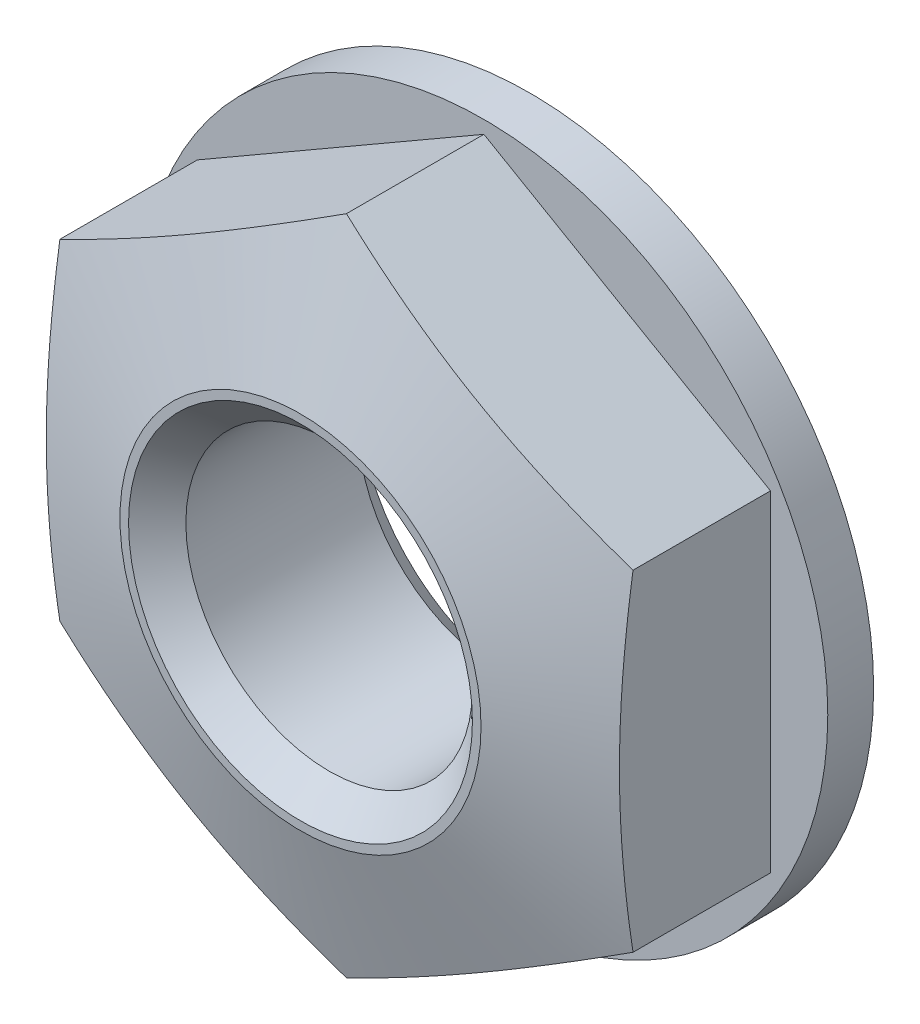
ISO-10303-21;
HEADER;
FILE_DESCRIPTION(('STEP AP214'),'2;1');
FILE_NAME('part.step','',(''),(''),'','','');
FILE_SCHEMA(('AUTOMOTIVE_DESIGN { 1 0 10303 214 1 1 1 1 }'));
ENDSEC;
DATA;
#1=APPLICATION_CONTEXT('core data for automotive mechanical design processes');
#2=APPLICATION_PROTOCOL_DEFINITION('international standard','automotive_design',2000,#1);
#3=PRODUCT_CONTEXT('',#1,'mechanical');
#4=PRODUCT('Part','Part','',(#3));
#5=PRODUCT_RELATED_PRODUCT_CATEGORY('part','',(#4));
#6=PRODUCT_DEFINITION_FORMATION('','',#4);
#7=PRODUCT_DEFINITION_CONTEXT('part definition',#1,'design');
#8=PRODUCT_DEFINITION('design','',#6,#7);
#9=PRODUCT_DEFINITION_SHAPE('','',#8);
#10=(LENGTH_UNIT() NAMED_UNIT(*) SI_UNIT(.MILLI.,.METRE.));
#11=(NAMED_UNIT(*) PLANE_ANGLE_UNIT() SI_UNIT($,.RADIAN.));
#12=(NAMED_UNIT(*) SI_UNIT($,.STERADIAN.) SOLID_ANGLE_UNIT());
#13=UNCERTAINTY_MEASURE_WITH_UNIT(LENGTH_MEASURE(1.E-05),#10,'distance_accuracy_value','');
#14=(GEOMETRIC_REPRESENTATION_CONTEXT(3) GLOBAL_UNCERTAINTY_ASSIGNED_CONTEXT((#13)) GLOBAL_UNIT_ASSIGNED_CONTEXT((#10,
#11,#12)) REPRESENTATION_CONTEXT('',''));
#15=CARTESIAN_POINT('',(0.,0.,0.));
#16=DIRECTION('',(0.,0.,1.));
#17=DIRECTION('',(1.,0.,0.));
#18=AXIS2_PLACEMENT_3D('',#15,#16,#17);
#19=CARTESIAN_POINT('',(5.,2.88675134594813,4.));
#20=DIRECTION('',(-0.5,-0.866025403784439,0.));
#21=DIRECTION('',(0.866025403784439,-0.5,0.));
#22=AXIS2_PLACEMENT_3D('',#19,#20,#21);
#23=PLANE('',#22);
#24=CARTESIAN_POINT('',(5.0002,2.88663587589429,3.19787943040062));
#25=CARTESIAN_POINT('',(4.79275315005902,3.00640537055026,3.23451207718111));
#26=CARTESIAN_POINT('',(4.58481913141722,3.12645613218678,3.26779270758337));
#27=CARTESIAN_POINT('',(4.16799578240542,3.36710920494327,3.3262927245739));
#28=CARTESIAN_POINT('',(3.95910599971381,3.48771177721123,3.35150778062892));
#29=CARTESIAN_POINT('',(3.54201529126278,3.72851921001192,3.39233992073676));
#30=CARTESIAN_POINT('',(3.33381913247233,3.84872131833384,3.4080202023214));
#31=CARTESIAN_POINT('',(2.91708191432316,4.08932466341359,3.4290480365763));
#32=CARTESIAN_POINT('',(2.70854095716158,4.2097258411679,3.43439823930148));
#33=CARTESIAN_POINT('',(2.29145904283842,4.45052819667649,3.43439823930148));
#34=CARTESIAN_POINT('',(2.08291808567684,4.57092937443079,3.4290480365763));
#35=CARTESIAN_POINT('',(1.66618086752767,4.81153271951055,3.4080202023214));
#36=CARTESIAN_POINT('',(1.45798470873722,4.93173482783247,3.39233992073676));
#37=CARTESIAN_POINT('',(1.04089400028619,5.17254226063316,3.35150778062892));
#38=CARTESIAN_POINT('',(0.832004217594584,5.29314483290112,3.3262927245739));
#39=CARTESIAN_POINT('',(0.415180868582782,5.53379790565761,3.26779270758337));
#40=CARTESIAN_POINT('',(0.207246849940983,5.65384866729413,3.23451207718112));
#41=CARTESIAN_POINT('',(-0.000199999999998796,5.7736181619501,3.19787943040062));
#42=B_SPLINE_CURVE_WITH_KNOTS('',3,(#24,#25,#26,#27,#28,#29,#30,#31,#32,#33,#34,#35,#36,#37,#38,
#39,#40,#41),.UNSPECIFIED.,.F.,.F.,(4,2,2,2,2,2,2,2,4),(0.,0.727022535617263,1.45443476834913,
2.17697153055248,2.89932291017882,3.62167428980516,4.34421105200851,5.07162328474038,
5.79864582035764),.UNSPECIFIED.);
#43=CARTESIAN_POINT('',(5.,2.88675134594813,3.19791473419793));
#44=VERTEX_POINT('',#43);
#45=CARTESIAN_POINT('',(0.,5.77350269189626,3.19791473419793));
#46=VERTEX_POINT('',#45);
#47=EDGE_CURVE('E100',#44,#46,#42,.T.);
#48=ORIENTED_EDGE('',*,*,#47,.F.);
#49=DIRECTION('',(0.,0.,-1.));
#50=VECTOR('',#49,1.);
#51=CARTESIAN_POINT('',(5.,2.88675134594813,4.));
#52=LINE('',#51,#50);
#53=CARTESIAN_POINT('',(5.,2.88675134594813,0.8));
#54=VERTEX_POINT('',#53);
#55=EDGE_CURVE('E69',#44,#54,#52,.T.);
#56=ORIENTED_EDGE('',*,*,#55,.T.);
#57=DIRECTION('',(-0.866025403784439,0.5,0.));
#58=VECTOR('',#57,1.);
#59=CARTESIAN_POINT('',(5.,2.88675134594813,0.8));
#60=LINE('',#59,#58);
#61=CARTESIAN_POINT('',(0.,5.77350269189626,0.8));
#62=VERTEX_POINT('',#61);
#63=EDGE_CURVE('E110',#54,#62,#60,.T.);
#64=ORIENTED_EDGE('',*,*,#63,.T.);
#65=DIRECTION('',(0.,0.,-1.));
#66=VECTOR('',#65,1.);
#67=CARTESIAN_POINT('',(0.,5.77350269189626,4.));
#68=LINE('',#67,#66);
#69=EDGE_CURVE('E108',#46,#62,#68,.T.);
#70=ORIENTED_EDGE('',*,*,#69,.F.);
#71=EDGE_LOOP('',(#48,#56,#64,#70));
#72=FACE_BOUND('',#71,.T.);
#73=ADVANCED_FACE('F44',(#72),#23,.F.);
#74=CARTESIAN_POINT('',(0.,5.77350269189626,4.));
#75=DIRECTION('',(0.5,-0.866025403784439,0.));
#76=DIRECTION('',(0.866025403784439,0.5,0.));
#77=AXIS2_PLACEMENT_3D('',#74,#75,#76);
#78=PLANE('',#77);
#79=CARTESIAN_POINT('',(0.000200000000001004,5.7736181619501,3.19787943040062));
#80=CARTESIAN_POINT('',(-0.207246849940981,5.65384866729413,3.23451207718112));
#81=CARTESIAN_POINT('',(-0.41518086858278,5.53379790565761,3.26779270758337));
#82=CARTESIAN_POINT('',(-0.832004217594582,5.29314483290112,3.3262927245739));
#83=CARTESIAN_POINT('',(-1.04089400028619,5.17254226063316,3.35150778062892));
#84=CARTESIAN_POINT('',(-1.45798470873721,4.93173482783247,3.39233992073676));
#85=CARTESIAN_POINT('',(-1.66618086752767,4.81153271951055,3.4080202023214));
#86=CARTESIAN_POINT('',(-2.08291808567684,4.5709293744308,3.4290480365763));
#87=CARTESIAN_POINT('',(-2.29145904283842,4.45052819667649,3.43439823930148));
#88=CARTESIAN_POINT('',(-2.70854095716158,4.2097258411679,3.43439823930148));
#89=CARTESIAN_POINT('',(-2.91708191432316,4.08932466341359,3.4290480365763));
#90=CARTESIAN_POINT('',(-3.33381913247233,3.84872131833384,3.4080202023214));
#91=CARTESIAN_POINT('',(-3.54201529126278,3.72851921001192,3.39233992073676));
#92=CARTESIAN_POINT('',(-3.95910599971381,3.48771177721123,3.35150778062892));
#93=CARTESIAN_POINT('',(-4.16799578240542,3.36710920494327,3.3262927245739));
#94=CARTESIAN_POINT('',(-4.58481913141722,3.12645613218678,3.26779270758337));
#95=CARTESIAN_POINT('',(-4.79275315005902,3.00640537055026,3.23451207718112));
#96=CARTESIAN_POINT('',(-5.0002,2.88663587589429,3.19787943040062));
#97=B_SPLINE_CURVE_WITH_KNOTS('',3,(#79,#80,#81,#82,#83,#84,#85,#86,#87,#88,#89,#90,#91,#92,#93,
#94,#95,#96),.UNSPECIFIED.,.F.,.F.,(4,2,2,2,2,2,2,2,4),(0.,0.727022535617262,1.45443476834913,
2.17697153055248,2.89932291017882,3.62167428980516,4.34421105200851,5.07162328474038,
5.79864582035764),.UNSPECIFIED.);
#98=CARTESIAN_POINT('',(-5.,2.88675134594813,3.19791473419793));
#99=VERTEX_POINT('',#98);
#100=EDGE_CURVE('E111',#46,#99,#97,.T.);
#101=ORIENTED_EDGE('',*,*,#100,.F.);
#102=ORIENTED_EDGE('',*,*,#69,.T.);
#103=DIRECTION('',(-0.866025403784439,-0.5,0.));
#104=VECTOR('',#103,1.);
#105=CARTESIAN_POINT('',(0.,5.77350269189626,0.8));
#106=LINE('',#105,#104);
#107=CARTESIAN_POINT('',(-5.,2.88675134594813,0.8));
#108=VERTEX_POINT('',#107);
#109=EDGE_CURVE('E372',#62,#108,#106,.T.);
#110=ORIENTED_EDGE('',*,*,#109,.T.);
#111=DIRECTION('',(0.,0.,-1.));
#112=VECTOR('',#111,1.);
#113=CARTESIAN_POINT('',(-5.,2.88675134594813,4.));
#114=LINE('',#113,#112);
#115=EDGE_CURVE('E133',#99,#108,#114,.T.);
#116=ORIENTED_EDGE('',*,*,#115,.F.);
#117=EDGE_LOOP('',(#101,#102,#110,#116));
#118=FACE_BOUND('',#117,.T.);
#119=ADVANCED_FACE('F170',(#118),#78,.F.);
#120=CARTESIAN_POINT('',(-5.,2.88675134594813,4.));
#121=DIRECTION('',(1.,0.,0.));
#122=DIRECTION('',(0.,0.,-1.));
#123=AXIS2_PLACEMENT_3D('',#120,#121,#122);
#124=PLANE('',#123);
#125=CARTESIAN_POINT('',(-5.,9.4879613696743,1.6841501520735));
#126=CARTESIAN_POINT('',(-5.,9.26276217017883,1.74505240597475));
#127=CARTESIAN_POINT('',(-5.,9.03744703957066,1.80552980701248));
#128=CARTESIAN_POINT('',(-5.,8.58653391688883,1.92543548622956));
#129=CARTESIAN_POINT('',(-5.,8.3609359201367,1.98486374680482));
#130=CARTESIAN_POINT('',(-5.,7.90938340456376,2.10247754091083));
#131=CARTESIAN_POINT('',(-5.,7.68342884207687,2.16066290709155));
#132=CARTESIAN_POINT('',(-5.,7.23113464577386,2.27551664596486));
#133=CARTESIAN_POINT('',(-5.,7.00479501324153,2.33218502370449));
#134=CARTESIAN_POINT('',(-5.,6.54836147360987,2.44448371605446));
#135=CARTESIAN_POINT('',(-5.,6.31826087783559,2.50008691165399));
#136=CARTESIAN_POINT('',(-5.,5.85750538289537,2.6089456131666));
#137=CARTESIAN_POINT('',(-5.,5.62685048861831,2.66220113970644));
#138=CARTESIAN_POINT('',(-5.,5.1648366619678,2.76580983618681));
#139=CARTESIAN_POINT('',(-5.,4.93347759313882,2.81616240015874));
#140=CARTESIAN_POINT('',(-5.,4.46999415503253,2.91323427225066));
#141=CARTESIAN_POINT('',(-5.,4.23786978630245,2.95995358296794));
#142=CARTESIAN_POINT('',(-5.,3.78148117193377,3.04718866555743));
#143=CARTESIAN_POINT('',(-5.,3.55724907442231,3.08787150591459));
#144=CARTESIAN_POINT('',(-5.,3.10789882150138,3.16406383863538));
#145=CARTESIAN_POINT('',(-5.,2.88278066366243,3.19957331680412));
#146=CARTESIAN_POINT('',(-5.,2.43171248630081,3.26428912223046));
#147=CARTESIAN_POINT('',(-5.,2.20576279713335,3.29349772481427));
#148=CARTESIAN_POINT('',(-5.,1.75302578152784,3.3444439183428));
#149=CARTESIAN_POINT('',(-5.,1.52623851418495,3.36618202655992));
#150=CARTESIAN_POINT('',(-5.,1.07351451454953,3.40098627002373));
#151=CARTESIAN_POINT('',(-5.,0.847582245869291,3.41410946158622));
#152=CARTESIAN_POINT('',(-5.,0.395368008124588,3.43116097993806));
#153=CARTESIAN_POINT('',(-5.,0.169086044996081,3.43508946112597));
#154=CARTESIAN_POINT('',(-5.,-0.283454971545516,3.4335070723067));
#155=CARTESIAN_POINT('',(-5.,-0.50971402350535,3.4279957853868));
#156=CARTESIAN_POINT('',(-5.,-0.961817473531124,3.40787643801507));
#157=CARTESIAN_POINT('',(-5.,-1.18766186926731,3.39326832660847));
#158=CARTESIAN_POINT('',(-5.,-1.75050653072481,3.34646256241897));
#159=CARTESIAN_POINT('',(-5.,-2.08708015570961,3.30913436420126));
#160=CARTESIAN_POINT('',(-5.,-2.75819609564522,3.21968742433003));
#161=CARTESIAN_POINT('',(-5.,-3.09273832814343,3.16756808636081));
#162=CARTESIAN_POINT('',(-5.,-3.76163919790516,3.05196847876793));
#163=CARTESIAN_POINT('',(-5.,-4.09598754527558,2.9884296938615));
#164=CARTESIAN_POINT('',(-5.,-4.76299355203984,2.85320384916212));
#165=CARTESIAN_POINT('',(-5.,-5.09565128785745,2.78151716117867));
#166=CARTESIAN_POINT('',(-5.,-5.76960952076181,2.62996924210081));
#167=CARTESIAN_POINT('',(-5.,-6.11086897673249,2.54992697499391));
#168=CARTESIAN_POINT('',(-5.,-6.79228145364495,2.38525716676517));
#169=CARTESIAN_POINT('',(-5.,-7.13243444851711,2.30062951842371));
#170=CARTESIAN_POINT('',(-5.,-7.80887093381147,2.1287574529486));
#171=CARTESIAN_POINT('',(-5.,-8.14516202808079,2.04154282176829));
#172=CARTESIAN_POINT('',(-5.,-8.81703854173854,1.86456693448949));
#173=CARTESIAN_POINT('',(-5.,-9.15262402830049,1.77480593380093));
#174=CARTESIAN_POINT('',(-5.,-9.4879613696743,1.6841501520735));
#175=B_SPLINE_CURVE_WITH_KNOTS('',3,(#125,#126,#127,#128,#129,#130,#131,#132,#133,#134,#135,
#136,#137,#138,#139,#140,#141,#142,#143,#144,#145,#146,#147,#148,#149,#150,#151,#152,#153,#154,
#155,#156,#157,#158,#159,#160,#161,#162,#163,#164,#165,#166,#167,#168,#169,#170,#171,#172,#173,
#174),.UNSPECIFIED.,.F.,.F.,(4,2,2,2,2,2,2,2,2,2,2,2,2,2,2,2,2,2,2,2,2,2,2,2,4),(0.,
0.699868118029256,1.39974796837185,2.09972146777089,2.79969263805538,3.50985316952237,
4.22000746023707,4.9303094568254,5.64061094563802,6.32424062771874,7.00787218553723,
7.69125646052339,8.37459340703795,9.05335770996218,9.73211061492141,10.4108934981604,
11.0896801835535,12.1051367506999,13.1206342625445,14.1414919637197,15.1623030992565,
16.2138224356565,17.2653663702746,18.3076043198243,19.3497380962713),.UNSPECIFIED.);
#176=CARTESIAN_POINT('',(-5.,-2.88675134594813,3.19791473419793));
#177=VERTEX_POINT('',#176);
#178=EDGE_CURVE('E227',#99,#177,#175,.T.);
#179=ORIENTED_EDGE('',*,*,#178,.F.);
#180=ORIENTED_EDGE('',*,*,#115,.T.);
#181=DIRECTION('',(0.,-1.,0.));
#182=VECTOR('',#181,1.);
#183=CARTESIAN_POINT('',(-5.,2.88675134594813,0.8));
#184=LINE('',#183,#182);
#185=CARTESIAN_POINT('',(-5.,-2.88675134594813,0.8));
#186=VERTEX_POINT('',#185);
#187=EDGE_CURVE('E375',#108,#186,#184,.T.);
#188=ORIENTED_EDGE('',*,*,#187,.T.);
#189=DIRECTION('',(0.,0.,-1.));
#190=VECTOR('',#189,1.);
#191=CARTESIAN_POINT('',(-5.,-2.88675134594813,4.));
#192=LINE('',#191,#190);
#193=EDGE_CURVE('E130',#177,#186,#192,.T.);
#194=ORIENTED_EDGE('',*,*,#193,.F.);
#195=EDGE_LOOP('',(#179,#180,#188,#194));
#196=FACE_BOUND('',#195,.T.);
#197=ADVANCED_FACE('F175',(#196),#124,.F.);
#198=CARTESIAN_POINT('',(-5.,-2.88675134594813,4.));
#199=DIRECTION('',(0.5,0.866025403784439,0.));
#200=DIRECTION('',(-0.866025403784439,0.5,0.));
#201=AXIS2_PLACEMENT_3D('',#198,#199,#200);
#202=PLANE('',#201);
#203=CARTESIAN_POINT('',(-5.0002,-2.88663587589429,3.19787943040062));
#204=CARTESIAN_POINT('',(-4.79275315005902,-3.00640537055026,3.23451207718112));
#205=CARTESIAN_POINT('',(-4.58481913141722,-3.12645613218678,3.26779270758337));
#206=CARTESIAN_POINT('',(-4.16799578240542,-3.36710920494327,3.3262927245739));
#207=CARTESIAN_POINT('',(-3.95910599971381,-3.48771177721123,3.35150778062892));
#208=CARTESIAN_POINT('',(-3.54201529126279,-3.72851921001192,3.39233992073676));
#209=CARTESIAN_POINT('',(-3.33381913247233,-3.84872131833383,3.4080202023214));
#210=CARTESIAN_POINT('',(-2.91708191432316,-4.08932466341359,3.4290480365763));
#211=CARTESIAN_POINT('',(-2.70854095716158,-4.20972584116789,3.43439823930148));
#212=CARTESIAN_POINT('',(-2.29145904283842,-4.45052819667649,3.43439823930148));
#213=CARTESIAN_POINT('',(-2.08291808567684,-4.57092937443079,3.4290480365763));
#214=CARTESIAN_POINT('',(-1.66618086752767,-4.81153271951055,3.4080202023214));
#215=CARTESIAN_POINT('',(-1.45798470873722,-4.93173482783247,3.39233992073676));
#216=CARTESIAN_POINT('',(-1.04089400028619,-5.17254226063316,3.35150778062892));
#217=CARTESIAN_POINT('',(-0.832004217594584,-5.29314483290112,3.3262927245739));
#218=CARTESIAN_POINT('',(-0.415180868582783,-5.53379790565761,3.26779270758337));
#219=CARTESIAN_POINT('',(-0.207246849940984,-5.65384866729413,3.23451207718112));
#220=CARTESIAN_POINT('',(0.000199999999998601,-5.7736181619501,3.19787943040062));
#221=B_SPLINE_CURVE_WITH_KNOTS('',3,(#203,#204,#205,#206,#207,#208,#209,#210,#211,#212,#213,
#214,#215,#216,#217,#218,#219,#220),.UNSPECIFIED.,.F.,.F.,(4,2,2,2,2,2,2,2,4),(0.,
0.727022535617263,1.45443476834913,2.17697153055248,2.89932291017882,3.62167428980516,
4.34421105200851,5.07162328474038,5.79864582035764),.UNSPECIFIED.);
#222=CARTESIAN_POINT('',(0.,-5.77350269189626,3.19791473419793));
#223=VERTEX_POINT('',#222);
#224=EDGE_CURVE('E221',#177,#223,#221,.T.);
#225=ORIENTED_EDGE('',*,*,#224,.F.);
#226=ORIENTED_EDGE('',*,*,#193,.T.);
#227=DIRECTION('',(0.866025403784439,-0.5,0.));
#228=VECTOR('',#227,1.);
#229=CARTESIAN_POINT('',(-5.,-2.88675134594813,0.8));
#230=LINE('',#229,#228);
#231=CARTESIAN_POINT('',(0.,-5.77350269189626,0.8));
#232=VERTEX_POINT('',#231);
#233=EDGE_CURVE('E378',#186,#232,#230,.T.);
#234=ORIENTED_EDGE('',*,*,#233,.T.);
#235=DIRECTION('',(0.,0.,-1.));
#236=VECTOR('',#235,1.);
#237=CARTESIAN_POINT('',(0.,-5.77350269189626,4.));
#238=LINE('',#237,#236);
#239=EDGE_CURVE('E122',#223,#232,#238,.T.);
#240=ORIENTED_EDGE('',*,*,#239,.F.);
#241=EDGE_LOOP('',(#225,#226,#234,#240));
#242=FACE_BOUND('',#241,.T.);
#243=ADVANCED_FACE('F235',(#242),#202,.F.);
#244=CARTESIAN_POINT('',(0.,-5.77350269189626,4.));
#245=DIRECTION('',(-0.5,0.866025403784439,0.));
#246=DIRECTION('',(-0.866025403784439,-0.5,0.));
#247=AXIS2_PLACEMENT_3D('',#244,#245,#246);
#248=PLANE('',#247);
#249=CARTESIAN_POINT('',(-0.000200000000001729,-5.7736181619501,3.19787943040062));
#250=CARTESIAN_POINT('',(0.20724684994098,-5.65384866729413,3.23451207718112));
#251=CARTESIAN_POINT('',(0.415180868582779,-5.53379790565761,3.26779270758337));
#252=CARTESIAN_POINT('',(0.832004217594581,-5.29314483290112,3.3262927245739));
#253=CARTESIAN_POINT('',(1.04089400028619,-5.17254226063316,3.35150778062892));
#254=CARTESIAN_POINT('',(1.45798470873721,-4.93173482783247,3.39233992073676));
#255=CARTESIAN_POINT('',(1.66618086752767,-4.81153271951055,3.4080202023214));
#256=CARTESIAN_POINT('',(2.08291808567684,-4.57092937443079,3.4290480365763));
#257=CARTESIAN_POINT('',(2.29145904283842,-4.45052819667649,3.43439823930148));
#258=CARTESIAN_POINT('',(2.70854095716158,-4.2097258411679,3.43439823930148));
#259=CARTESIAN_POINT('',(2.91708191432316,-4.08932466341359,3.4290480365763));
#260=CARTESIAN_POINT('',(3.33381913247233,-3.84872131833384,3.4080202023214));
#261=CARTESIAN_POINT('',(3.54201529126278,-3.72851921001192,3.39233992073676));
#262=CARTESIAN_POINT('',(3.95910599971381,-3.48771177721123,3.35150778062892));
#263=CARTESIAN_POINT('',(4.16799578240541,-3.36710920494327,3.3262927245739));
#264=CARTESIAN_POINT('',(4.58481913141722,-3.12645613218678,3.26779270758337));
#265=CARTESIAN_POINT('',(4.79275315005902,-3.00640537055026,3.23451207718112));
#266=CARTESIAN_POINT('',(5.0002,-2.88663587589429,3.19787943040062));
#267=B_SPLINE_CURVE_WITH_KNOTS('',3,(#249,#250,#251,#252,#253,#254,#255,#256,#257,#258,#259,
#260,#261,#262,#263,#264,#265,#266),.UNSPECIFIED.,.F.,.F.,(4,2,2,2,2,2,2,2,4),(0.,
0.727022535617263,1.45443476834913,2.17697153055248,2.89932291017882,3.62167428980516,
4.34421105200851,5.07162328474038,5.79864582035764),.UNSPECIFIED.);
#268=CARTESIAN_POINT('',(5.,-2.88675134594813,3.19791473419793));
#269=VERTEX_POINT('',#268);
#270=EDGE_CURVE('E61',#223,#269,#267,.T.);
#271=ORIENTED_EDGE('',*,*,#270,.F.);
#272=ORIENTED_EDGE('',*,*,#239,.T.);
#273=DIRECTION('',(0.866025403784439,0.5,0.));
#274=VECTOR('',#273,1.);
#275=CARTESIAN_POINT('',(0.,-5.77350269189626,0.8));
#276=LINE('',#275,#274);
#277=CARTESIAN_POINT('',(5.,-2.88675134594813,0.8));
#278=VERTEX_POINT('',#277);
#279=EDGE_CURVE('E124',#232,#278,#276,.T.);
#280=ORIENTED_EDGE('',*,*,#279,.T.);
#281=DIRECTION('',(0.,0.,-1.));
#282=VECTOR('',#281,1.);
#283=CARTESIAN_POINT('',(5.,-2.88675134594813,4.));
#284=LINE('',#283,#282);
#285=EDGE_CURVE('E118',#269,#278,#284,.T.);
#286=ORIENTED_EDGE('',*,*,#285,.F.);
#287=EDGE_LOOP('',(#271,#272,#280,#286));
#288=FACE_BOUND('',#287,.T.);
#289=ADVANCED_FACE('F239',(#288),#248,.F.);
#290=CARTESIAN_POINT('',(5.,-2.88675134594813,4.));
#291=DIRECTION('',(-1.,0.,0.));
#292=DIRECTION('',(0.,-1.,0.));
#293=AXIS2_PLACEMENT_3D('',#290,#291,#292);
#294=PLANE('',#293);
#295=CARTESIAN_POINT('',(5.,-9.4879613696743,1.6841501520735));
#296=CARTESIAN_POINT('',(5.,-9.26276217017883,1.74505240597475));
#297=CARTESIAN_POINT('',(5.,-9.03744703957067,1.80552980701248));
#298=CARTESIAN_POINT('',(5.,-8.58653391688883,1.92543548622956));
#299=CARTESIAN_POINT('',(5.,-8.36093592013671,1.98486374680482));
#300=CARTESIAN_POINT('',(5.,-7.90938340456376,2.10247754091083));
#301=CARTESIAN_POINT('',(5.,-7.68342884207688,2.16066290709155));
#302=CARTESIAN_POINT('',(5.,-7.23113464577386,2.27551664596486));
#303=CARTESIAN_POINT('',(5.,-7.00479501324153,2.33218502370449));
#304=CARTESIAN_POINT('',(5.,-6.54836147360987,2.44448371605446));
#305=CARTESIAN_POINT('',(5.,-6.31826087783559,2.50008691165399));
#306=CARTESIAN_POINT('',(5.,-5.85750538289537,2.6089456131666));
#307=CARTESIAN_POINT('',(5.,-5.62685048861831,2.66220113970644));
#308=CARTESIAN_POINT('',(5.,-5.16483666196781,2.76580983618681));
#309=CARTESIAN_POINT('',(5.,-4.93347759313882,2.81616240015874));
#310=CARTESIAN_POINT('',(5.,-4.46999415503254,2.91323427225066));
#311=CARTESIAN_POINT('',(5.,-4.23786978630245,2.95995358296794));
#312=CARTESIAN_POINT('',(5.,-3.78148117193377,3.04718866555743));
#313=CARTESIAN_POINT('',(5.,-3.55724907442231,3.08787150591459));
#314=CARTESIAN_POINT('',(5.,-3.10789882150138,3.16406383863538));
#315=CARTESIAN_POINT('',(5.,-2.88278066366244,3.19957331680412));
#316=CARTESIAN_POINT('',(5.,-2.43171248630081,3.26428912223046));
#317=CARTESIAN_POINT('',(5.,-2.20576279713335,3.29349772481427));
#318=CARTESIAN_POINT('',(5.,-1.75302578152784,3.3444439183428));
#319=CARTESIAN_POINT('',(5.,-1.52623851418495,3.36618202655992));
#320=CARTESIAN_POINT('',(5.,-1.07351451454953,3.40098627002373));
#321=CARTESIAN_POINT('',(5.,-0.847582245869294,3.41410946158622));
#322=CARTESIAN_POINT('',(5.,-0.395368008124591,3.43116097993806));
#323=CARTESIAN_POINT('',(5.,-0.169086044996083,3.43508946112597));
#324=CARTESIAN_POINT('',(5.,0.283454971545515,3.4335070723067));
#325=CARTESIAN_POINT('',(5.,0.50971402350535,3.4279957853868));
#326=CARTESIAN_POINT('',(5.,0.961817473531123,3.40787643801507));
#327=CARTESIAN_POINT('',(5.,1.18766186926731,3.39326832660847));
#328=CARTESIAN_POINT('',(5.,1.75050653072481,3.34646256241897));
#329=CARTESIAN_POINT('',(5.,2.0870801557096,3.30913436420126));
#330=CARTESIAN_POINT('',(5.,2.75819609564522,3.21968742433004));
#331=CARTESIAN_POINT('',(5.,3.09273832814343,3.16756808636081));
#332=CARTESIAN_POINT('',(5.,3.76163919790516,3.05196847876793));
#333=CARTESIAN_POINT('',(5.,4.09598754527558,2.9884296938615));
#334=CARTESIAN_POINT('',(5.,4.76299355203984,2.85320384916212));
#335=CARTESIAN_POINT('',(5.,5.09565128785745,2.78151716117867));
#336=CARTESIAN_POINT('',(5.,5.76960952076181,2.62996924210081));
#337=CARTESIAN_POINT('',(5.,6.1108689767325,2.54992697499391));
#338=CARTESIAN_POINT('',(5.,6.79228145364495,2.38525716676517));
#339=CARTESIAN_POINT('',(5.,7.13243444851712,2.30062951842371));
#340=CARTESIAN_POINT('',(5.,7.80887093381148,2.1287574529486));
#341=CARTESIAN_POINT('',(5.,8.1451620280808,2.04154282176828));
#342=CARTESIAN_POINT('',(5.,8.81703854173855,1.86456693448948));
#343=CARTESIAN_POINT('',(5.,9.1526240283005,1.77480593380093));
#344=CARTESIAN_POINT('',(5.,9.4879613696743,1.6841501520735));
#345=B_SPLINE_CURVE_WITH_KNOTS('',3,(#295,#296,#297,#298,#299,#300,#301,#302,#303,#304,#305,
#306,#307,#308,#309,#310,#311,#312,#313,#314,#315,#316,#317,#318,#319,#320,#321,#322,#323,#324,
#325,#326,#327,#328,#329,#330,#331,#332,#333,#334,#335,#336,#337,#338,#339,#340,#341,#342,#343,
#344),.UNSPECIFIED.,.F.,.F.,(4,2,2,2,2,2,2,2,2,2,2,2,2,2,2,2,2,2,2,2,2,2,2,2,4),(0.,
0.699868118029256,1.39974796837185,2.09972146777089,2.79969263805538,3.50985316952237,
4.22000746023707,4.9303094568254,5.64061094563802,6.32424062771874,7.00787218553723,
7.69125646052339,8.37459340703795,9.05335770996218,9.73211061492141,10.4108934981604,
11.0896801835535,12.1051367506999,13.1206342625445,14.1414919637197,15.1623030992565,
16.2138224356566,17.2653663702746,18.3076043198243,19.3497380962713),.UNSPECIFIED.);
#346=EDGE_CURVE('E98',#269,#44,#345,.T.);
#347=ORIENTED_EDGE('',*,*,#346,.F.);
#348=ORIENTED_EDGE('',*,*,#285,.T.);
#349=DIRECTION('',(0.,1.,0.));
#350=VECTOR('',#349,1.);
#351=CARTESIAN_POINT('',(5.,-2.88675134594813,0.8));
#352=LINE('',#351,#350);
#353=EDGE_CURVE('E116',#278,#54,#352,.T.);
#354=ORIENTED_EDGE('',*,*,#353,.T.);
#355=ORIENTED_EDGE('',*,*,#55,.F.);
#356=EDGE_LOOP('',(#347,#348,#354,#355));
#357=FACE_BOUND('',#356,.T.);
#358=ADVANCED_FACE('F114',(#357),#294,.F.);
#359=CARTESIAN_POINT('',(0.,0.,0.8));
#360=DIRECTION('',(0.,0.,-1.));
#361=DIRECTION('',(-1.,0.,0.));
#362=AXIS2_PLACEMENT_3D('',#359,#360,#361);
#363=CYLINDRICAL_SURFACE('',#362,6.);
#364=CARTESIAN_POINT('',(0.,0.,0.8));
#365=DIRECTION('',(0.,0.,1.));
#366=DIRECTION('',(1.,0.,0.));
#367=AXIS2_PLACEMENT_3D('',#364,#365,#366);
#368=CIRCLE('',#367,6.);
#369=CARTESIAN_POINT('',(6.,0.,0.8));
#370=VERTEX_POINT('',#369);
#371=EDGE_CURVE('E139',#370,#370,#368,.T.);
#372=ORIENTED_EDGE('',*,*,#371,.F.);
#373=EDGE_LOOP('',(#372));
#374=FACE_BOUND('',#373,.T.);
#375=CARTESIAN_POINT('',(0.,0.,0.));
#376=DIRECTION('',(0.,0.,1.));
#377=DIRECTION('',(1.,0.,0.));
#378=AXIS2_PLACEMENT_3D('',#375,#376,#377);
#379=CIRCLE('',#378,6.);
#380=CARTESIAN_POINT('',(6.,0.,0.));
#381=VERTEX_POINT('',#380);
#382=EDGE_CURVE('E138',#381,#381,#379,.T.);
#383=ORIENTED_EDGE('',*,*,#382,.T.);
#384=EDGE_LOOP('',(#383));
#385=FACE_BOUND('',#384,.T.);
#386=ADVANCED_FACE('F246',(#374,#385),#363,.T.);
#387=CARTESIAN_POINT('',(0.,0.,0.8));
#388=DIRECTION('',(0.,0.,1.));
#389=DIRECTION('',(1.,0.,0.));
#390=AXIS2_PLACEMENT_3D('',#387,#388,#389);
#391=PLANE('',#390);
#392=ORIENTED_EDGE('',*,*,#63,.F.);
#393=ORIENTED_EDGE('',*,*,#353,.F.);
#394=ORIENTED_EDGE('',*,*,#279,.F.);
#395=ORIENTED_EDGE('',*,*,#233,.F.);
#396=ORIENTED_EDGE('',*,*,#187,.F.);
#397=ORIENTED_EDGE('',*,*,#109,.F.);
#398=EDGE_LOOP('',(#392,#393,#394,#395,#396,#397));
#399=FACE_BOUND('',#398,.T.);
#400=ORIENTED_EDGE('',*,*,#371,.T.);
#401=EDGE_LOOP('',(#400));
#402=FACE_BOUND('',#401,.T.);
#403=ADVANCED_FACE('F182',(#399,#402),#391,.T.);
#404=CARTESIAN_POINT('',(0.,0.,0.));
#405=DIRECTION('',(0.,0.,1.));
#406=DIRECTION('',(1.,0.,0.));
#407=AXIS2_PLACEMENT_3D('',#404,#405,#406);
#408=PLANE('',#407);
#409=CARTESIAN_POINT('',(0.,0.,0.));
#410=DIRECTION('',(0.,0.,1.));
#411=DIRECTION('',(1.,0.,0.));
#412=AXIS2_PLACEMENT_3D('',#409,#410,#411);
#413=CIRCLE('',#412,3.);
#414=CARTESIAN_POINT('',(3.,0.,0.));
#415=VERTEX_POINT('',#414);
#416=EDGE_CURVE('E54',#415,#415,#413,.T.);
#417=ORIENTED_EDGE('',*,*,#416,.T.);
#418=EDGE_LOOP('',(#417));
#419=FACE_BOUND('',#418,.T.);
#420=ORIENTED_EDGE('',*,*,#382,.F.);
#421=EDGE_LOOP('',(#420));
#422=FACE_BOUND('',#421,.T.);
#423=ADVANCED_FACE('F157',(#419,#422),#408,.F.);
#424=CARTESIAN_POINT('',(0.,0.,4.));
#425=DIRECTION('',(0.,0.,-1.));
#426=DIRECTION('',(1.,0.,0.));
#427=AXIS2_PLACEMENT_3D('',#424,#425,#426);
#428=CONICAL_SURFACE('',#427,3.15,1.27409035395586);
#429=CARTESIAN_POINT('',(0.,0.,4.));
#430=DIRECTION('',(0.,0.,1.));
#431=DIRECTION('',(1.,0.,0.));
#432=AXIS2_PLACEMENT_3D('',#429,#430,#431);
#433=CIRCLE('',#432,3.15);
#434=CARTESIAN_POINT('',(3.15,0.,4.));
#435=VERTEX_POINT('',#434);
#436=EDGE_CURVE('E105',#435,#435,#433,.T.);
#437=ORIENTED_EDGE('',*,*,#436,.F.);
#438=EDGE_LOOP('',(#437));
#439=FACE_BOUND('',#438,.T.);
#440=ORIENTED_EDGE('',*,*,#47,.T.);
#441=ORIENTED_EDGE('',*,*,#100,.T.);
#442=ORIENTED_EDGE('',*,*,#178,.T.);
#443=ORIENTED_EDGE('',*,*,#224,.T.);
#444=ORIENTED_EDGE('',*,*,#270,.T.);
#445=ORIENTED_EDGE('',*,*,#346,.T.);
#446=EDGE_LOOP('',(#440,#441,#442,#443,#444,#445));
#447=FACE_BOUND('',#446,.T.);
#448=ADVANCED_FACE('F99',(#439,#447),#428,.T.);
#449=CARTESIAN_POINT('',(0.,0.,4.));
#450=DIRECTION('',(0.,0.,1.));
#451=DIRECTION('',(1.,0.,0.));
#452=AXIS2_PLACEMENT_3D('',#449,#450,#451);
#453=PLANE('',#452);
#454=CARTESIAN_POINT('',(0.,0.,4.));
#455=DIRECTION('',(0.,0.,1.));
#456=DIRECTION('',(1.,0.,0.));
#457=AXIS2_PLACEMENT_3D('',#454,#455,#456);
#458=CIRCLE('',#457,3.);
#459=CARTESIAN_POINT('',(3.,0.,4.));
#460=VERTEX_POINT('',#459);
#461=EDGE_CURVE('E150',#460,#460,#458,.F.);
#462=ORIENTED_EDGE('',*,*,#461,.T.);
#463=EDGE_LOOP('',(#462));
#464=FACE_BOUND('',#463,.T.);
#465=ORIENTED_EDGE('',*,*,#436,.T.);
#466=EDGE_LOOP('',(#465));
#467=FACE_BOUND('',#466,.T.);
#468=ADVANCED_FACE('F201',(#464,#467),#453,.T.);
#469=CARTESIAN_POINT('',(0.,0.,4.));
#470=DIRECTION('',(0.,0.,1.));
#471=DIRECTION('',(1.,0.,0.));
#472=AXIS2_PLACEMENT_3D('',#469,#470,#471);
#473=CYLINDRICAL_SURFACE('',#472,2.5);
#474=CARTESIAN_POINT('',(0.,0.,0.500000000000003));
#475=DIRECTION('',(0.,0.,1.));
#476=DIRECTION('',(1.,0.,0.));
#477=AXIS2_PLACEMENT_3D('',#474,#475,#476);
#478=CIRCLE('',#477,2.5);
#479=CARTESIAN_POINT('',(2.5,0.,0.500000000000003));
#480=VERTEX_POINT('',#479);
#481=EDGE_CURVE('E12',#480,#480,#478,.F.);
#482=ORIENTED_EDGE('',*,*,#481,.T.);
#483=EDGE_LOOP('',(#482));
#484=FACE_BOUND('',#483,.T.);
#485=CARTESIAN_POINT('',(0.,0.,3.5));
#486=DIRECTION('',(0.,0.,1.));
#487=DIRECTION('',(1.,0.,0.));
#488=AXIS2_PLACEMENT_3D('',#485,#486,#487);
#489=CIRCLE('',#488,2.5);
#490=CARTESIAN_POINT('',(2.5,0.,3.5));
#491=VERTEX_POINT('',#490);
#492=EDGE_CURVE('E143',#491,#491,#489,.T.);
#493=ORIENTED_EDGE('',*,*,#492,.T.);
#494=EDGE_LOOP('',(#493));
#495=FACE_BOUND('',#494,.T.);
#496=ADVANCED_FACE('F166',(#484,#495),#473,.F.);
#497=CARTESIAN_POINT('',(0.,0.,3.5));
#498=DIRECTION('',(0.,0.,1.));
#499=DIRECTION('',(1.,0.,0.));
#500=AXIS2_PLACEMENT_3D('',#497,#498,#499);
#501=CONICAL_SURFACE('',#500,2.5,0.785398163397448);
#502=ORIENTED_EDGE('',*,*,#461,.F.);
#503=EDGE_LOOP('',(#502));
#504=FACE_BOUND('',#503,.T.);
#505=ORIENTED_EDGE('',*,*,#492,.F.);
#506=EDGE_LOOP('',(#505));
#507=FACE_BOUND('',#506,.T.);
#508=ADVANCED_FACE('F161',(#504,#507),#501,.F.);
#509=CARTESIAN_POINT('',(0.,0.,0.));
#510=DIRECTION('',(0.,0.,-1.));
#511=DIRECTION('',(-1.,0.,0.));
#512=AXIS2_PLACEMENT_3D('',#509,#510,#511);
#513=CONICAL_SURFACE('',#512,3.,0.785398163397448);
#514=ORIENTED_EDGE('',*,*,#481,.F.);
#515=EDGE_LOOP('',(#514));
#516=FACE_BOUND('',#515,.T.);
#517=ORIENTED_EDGE('',*,*,#416,.F.);
#518=EDGE_LOOP('',(#517));
#519=FACE_BOUND('',#518,.T.);
#520=ADVANCED_FACE('F47',(#516,#519),#513,.F.);
#521=CLOSED_SHELL('',(#73,#119,#197,#243,#289,#358,#386,#403,#423,#448,#468,#496,#508,#520));
#522=MANIFOLD_SOLID_BREP('B2',#521);
#523=ADVANCED_BREP_SHAPE_REPRESENTATION('',(#18,#522),#14);
#524=SHAPE_DEFINITION_REPRESENTATION(#9,#523);
ENDSEC;
END-ISO-10303-21;
